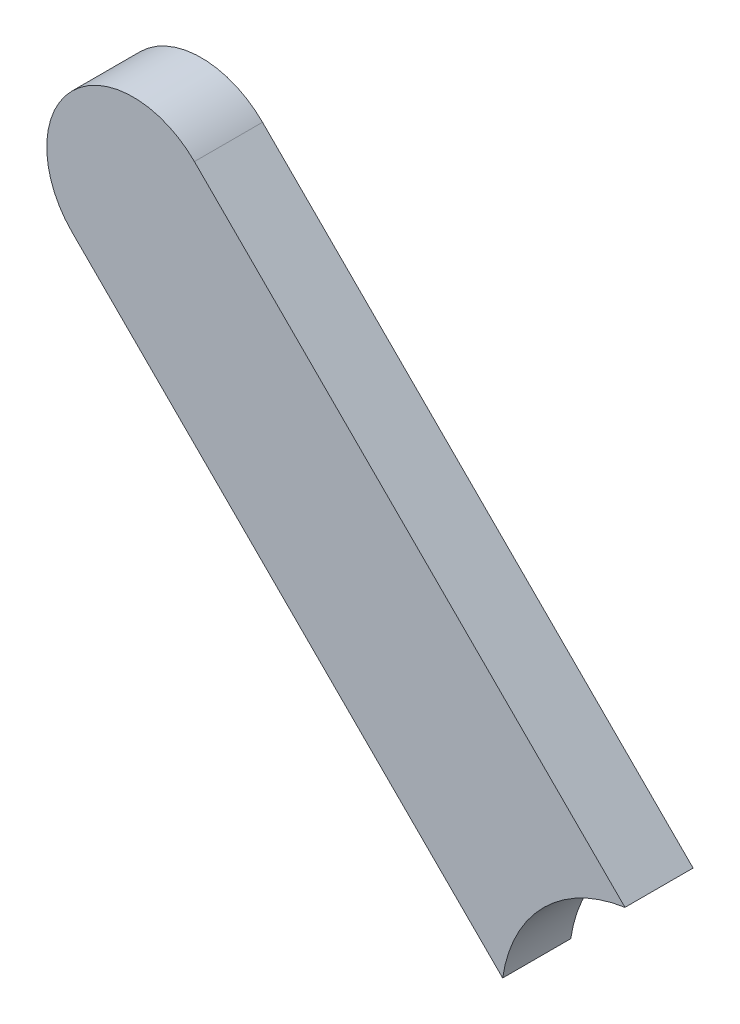
ISO-10303-21;
HEADER;
FILE_DESCRIPTION(('STEP AP214'),'2;1');
FILE_NAME('part.step','',(''),(''),'','','');
FILE_SCHEMA(('AUTOMOTIVE_DESIGN { 1 0 10303 214 1 1 1 1 }'));
ENDSEC;
DATA;
#1=APPLICATION_CONTEXT('core data for automotive mechanical design processes');
#2=APPLICATION_PROTOCOL_DEFINITION('international standard','automotive_design',2000,#1);
#3=PRODUCT_CONTEXT('',#1,'mechanical');
#4=PRODUCT('Part','Part','',(#3));
#5=PRODUCT_RELATED_PRODUCT_CATEGORY('part','',(#4));
#6=PRODUCT_DEFINITION_FORMATION('','',#4);
#7=PRODUCT_DEFINITION_CONTEXT('part definition',#1,'design');
#8=PRODUCT_DEFINITION('design','',#6,#7);
#9=PRODUCT_DEFINITION_SHAPE('','',#8);
#10=(LENGTH_UNIT() NAMED_UNIT(*) SI_UNIT(.MILLI.,.METRE.));
#11=(NAMED_UNIT(*) PLANE_ANGLE_UNIT() SI_UNIT($,.RADIAN.));
#12=(NAMED_UNIT(*) SI_UNIT($,.STERADIAN.) SOLID_ANGLE_UNIT());
#13=UNCERTAINTY_MEASURE_WITH_UNIT(LENGTH_MEASURE(1.E-05),#10,'distance_accuracy_value','');
#14=(GEOMETRIC_REPRESENTATION_CONTEXT(3) GLOBAL_UNCERTAINTY_ASSIGNED_CONTEXT((#13)) GLOBAL_UNIT_ASSIGNED_CONTEXT((#10,
#11,#12)) REPRESENTATION_CONTEXT('',''));
#15=CARTESIAN_POINT('',(0.,0.,0.));
#16=DIRECTION('',(0.,0.,1.));
#17=DIRECTION('',(1.,0.,0.));
#18=AXIS2_PLACEMENT_3D('',#15,#16,#17);
#19=CARTESIAN_POINT('',(91.61599406,56.56729606,0.));
#20=DIRECTION('',(0.707106781186546,0.707106781186549,0.));
#21=DIRECTION('',(0.707106781186549,-0.707106781186546,0.));
#22=AXIS2_PLACEMENT_3D('',#19,#20,#21);
#23=PLANE('',#22);
#24=DIRECTION('',(0.707106781186549,-0.707106781186546,0.));
#25=VECTOR('',#24,1.);
#26=CARTESIAN_POINT('',(91.61599406,56.56729606,0.1999996));
#27=LINE('',#26,#25);
#28=CARTESIAN_POINT('',(91.61599406,56.56729606,0.1999996));
#29=VERTEX_POINT('',#28);
#30=CARTESIAN_POINT('',(92.8804564845497,55.3028336354503,0.1999996));
#31=VERTEX_POINT('',#30);
#32=EDGE_CURVE('E11',#29,#31,#27,.T.);
#33=ORIENTED_EDGE('',*,*,#32,.F.);
#34=DIRECTION('',(0.,0.,1.));
#35=VECTOR('',#34,1.);
#36=CARTESIAN_POINT('',(91.61599406,56.56729606,0.));
#37=LINE('',#36,#35);
#38=CARTESIAN_POINT('',(91.61599406,56.56729606,0.));
#39=VERTEX_POINT('',#38);
#40=EDGE_CURVE('E24',#39,#29,#37,.T.);
#41=ORIENTED_EDGE('',*,*,#40,.F.);
#42=DIRECTION('',(0.707106781186549,-0.707106781186546,0.));
#43=VECTOR('',#42,1.);
#44=CARTESIAN_POINT('',(91.61599406,56.56729606,0.));
#45=LINE('',#44,#43);
#46=CARTESIAN_POINT('',(92.8804564845497,55.3028336354503,0.));
#47=VERTEX_POINT('',#46);
#48=EDGE_CURVE('E75',#39,#47,#45,.T.);
#49=ORIENTED_EDGE('',*,*,#48,.T.);
#50=DIRECTION('',(0.,0.,1.));
#51=VECTOR('',#50,1.);
#52=CARTESIAN_POINT('',(92.8804564845497,55.3028336354503,0.));
#53=LINE('',#52,#51);
#54=EDGE_CURVE('E37',#47,#31,#53,.T.);
#55=ORIENTED_EDGE('',*,*,#54,.T.);
#56=EDGE_LOOP('',(#33,#41,#49,#55));
#57=FACE_BOUND('',#56,.T.);
#58=ADVANCED_FACE('F17',(#57),#23,.F.);
#59=CARTESIAN_POINT('',(93.3010072,55.2414948,0.));
#60=DIRECTION('',(0.,0.,-1.));
#61=DIRECTION('',(1.,0.,0.));
#62=AXIS2_PLACEMENT_3D('',#59,#60,#61);
#63=CYLINDRICAL_SURFACE('',#62,0.42500042);
#64=DIRECTION('',(0.,0.,1.));
#65=VECTOR('',#64,1.);
#66=CARTESIAN_POINT('',(93.2396683645496,55.6620455154503,0.));
#67=LINE('',#66,#65);
#68=CARTESIAN_POINT('',(93.2396683645496,55.6620455154503,0.));
#69=VERTEX_POINT('',#68);
#70=CARTESIAN_POINT('',(93.2396683645496,55.6620455154503,0.1999996));
#71=VERTEX_POINT('',#70);
#72=EDGE_CURVE('E67',#69,#71,#67,.T.);
#73=ORIENTED_EDGE('',*,*,#72,.T.);
#74=CARTESIAN_POINT('',(93.3010072,55.2414948,0.1999996));
#75=DIRECTION('',(0.,0.,1.));
#76=DIRECTION('',(1.,0.,0.));
#77=AXIS2_PLACEMENT_3D('',#74,#75,#76);
#78=CIRCLE('',#77,0.42500042);
#79=EDGE_CURVE('E82',#71,#31,#78,.T.);
#80=ORIENTED_EDGE('',*,*,#79,.T.);
#81=ORIENTED_EDGE('',*,*,#54,.F.);
#82=CARTESIAN_POINT('',(93.3010072,55.2414948,0.));
#83=DIRECTION('',(0.,0.,1.));
#84=DIRECTION('',(1.,0.,0.));
#85=AXIS2_PLACEMENT_3D('',#82,#83,#84);
#86=CIRCLE('',#85,0.42500042);
#87=EDGE_CURVE('E80',#69,#47,#86,.T.);
#88=ORIENTED_EDGE('',*,*,#87,.F.);
#89=EDGE_LOOP('',(#73,#80,#81,#88));
#90=FACE_BOUND('',#89,.T.);
#91=ADVANCED_FACE('F88',(#90),#63,.F.);
#92=CARTESIAN_POINT('',(93.2396683645497,55.6620455154503,0.));
#93=DIRECTION('',(-0.707106781186548,-0.707106781186548,0.));
#94=DIRECTION('',(-0.707106781186548,0.707106781186548,0.));
#95=AXIS2_PLACEMENT_3D('',#92,#93,#94);
#96=PLANE('',#95);
#97=DIRECTION('',(-0.707106781186548,0.707106781186548,0.));
#98=VECTOR('',#97,1.);
#99=CARTESIAN_POINT('',(93.48061314,55.42110074,0.1999996));
#100=LINE('',#99,#98);
#101=CARTESIAN_POINT('',(91.97520594,56.92650794,0.1999996));
#102=VERTEX_POINT('',#101);
#103=EDGE_CURVE('E71',#71,#102,#100,.T.);
#104=ORIENTED_EDGE('',*,*,#103,.F.);
#105=ORIENTED_EDGE('',*,*,#72,.F.);
#106=DIRECTION('',(-0.707106781186548,0.707106781186548,0.));
#107=VECTOR('',#106,1.);
#108=CARTESIAN_POINT('',(93.48061314,55.42110074,0.));
#109=LINE('',#108,#107);
#110=CARTESIAN_POINT('',(91.97520594,56.92650794,0.));
#111=VERTEX_POINT('',#110);
#112=EDGE_CURVE('E63',#69,#111,#109,.T.);
#113=ORIENTED_EDGE('',*,*,#112,.T.);
#114=DIRECTION('',(0.,0.,1.));
#115=VECTOR('',#114,1.);
#116=CARTESIAN_POINT('',(91.97520594,56.92650794,0.));
#117=LINE('',#116,#115);
#118=EDGE_CURVE('E53',#111,#102,#117,.T.);
#119=ORIENTED_EDGE('',*,*,#118,.T.);
#120=EDGE_LOOP('',(#104,#105,#113,#119));
#121=FACE_BOUND('',#120,.T.);
#122=ADVANCED_FACE('F66',(#121),#96,.F.);
#123=CARTESIAN_POINT('',(91.7956,56.746902,0.));
#124=DIRECTION('',(0.,0.,-1.));
#125=DIRECTION('',(0.707106781186548,0.707106781186548,0.));
#126=AXIS2_PLACEMENT_3D('',#123,#124,#125);
#127=CYLINDRICAL_SURFACE('',#126,0.254001156230769);
#128=CARTESIAN_POINT('',(91.7956,56.746902,0.1999996));
#129=DIRECTION('',(0.,0.,1.));
#130=DIRECTION('',(0.707106781186548,0.707106781186548,0.));
#131=AXIS2_PLACEMENT_3D('',#128,#129,#130);
#132=CIRCLE('',#131,0.254001156230769);
#133=EDGE_CURVE('E59',#102,#29,#132,.T.);
#134=ORIENTED_EDGE('',*,*,#133,.F.);
#135=ORIENTED_EDGE('',*,*,#118,.F.);
#136=CARTESIAN_POINT('',(91.7956,56.746902,0.));
#137=DIRECTION('',(0.,0.,1.));
#138=DIRECTION('',(0.707106781186548,0.707106781186548,0.));
#139=AXIS2_PLACEMENT_3D('',#136,#137,#138);
#140=CIRCLE('',#139,0.254001156230769);
#141=EDGE_CURVE('E57',#111,#39,#140,.T.);
#142=ORIENTED_EDGE('',*,*,#141,.T.);
#143=ORIENTED_EDGE('',*,*,#40,.T.);
#144=EDGE_LOOP('',(#134,#135,#142,#143));
#145=FACE_BOUND('',#144,.T.);
#146=ADVANCED_FACE('F55',(#145),#127,.T.);
#147=CARTESIAN_POINT('',(91.61599406,56.56729606,0.));
#148=DIRECTION('',(0.,0.,-1.));
#149=DIRECTION('',(-1.,0.,0.));
#150=AXIS2_PLACEMENT_3D('',#147,#148,#149);
#151=PLANE('',#150);
#152=ORIENTED_EDGE('',*,*,#48,.F.);
#153=ORIENTED_EDGE('',*,*,#141,.F.);
#154=ORIENTED_EDGE('',*,*,#112,.F.);
#155=ORIENTED_EDGE('',*,*,#87,.T.);
#156=EDGE_LOOP('',(#152,#153,#154,#155));
#157=FACE_BOUND('',#156,.T.);
#158=ADVANCED_FACE('F74',(#157),#151,.T.);
#159=CARTESIAN_POINT('',(91.61599406,56.56729606,0.1999996));
#160=DIRECTION('',(0.,0.,-1.));
#161=DIRECTION('',(-1.,0.,0.));
#162=AXIS2_PLACEMENT_3D('',#159,#160,#161);
#163=PLANE('',#162);
#164=ORIENTED_EDGE('',*,*,#133,.T.);
#165=ORIENTED_EDGE('',*,*,#32,.T.);
#166=ORIENTED_EDGE('',*,*,#79,.F.);
#167=ORIENTED_EDGE('',*,*,#103,.T.);
#168=EDGE_LOOP('',(#164,#165,#166,#167));
#169=FACE_BOUND('',#168,.T.);
#170=ADVANCED_FACE('F91',(#169),#163,.F.);
#171=CLOSED_SHELL('',(#58,#91,#122,#146,#158,#170));
#172=MANIFOLD_SOLID_BREP('B1',#171);
#173=ADVANCED_BREP_SHAPE_REPRESENTATION('',(#18,#172),#14);
#174=SHAPE_DEFINITION_REPRESENTATION(#9,#173);
ENDSEC;
END-ISO-10303-21;
